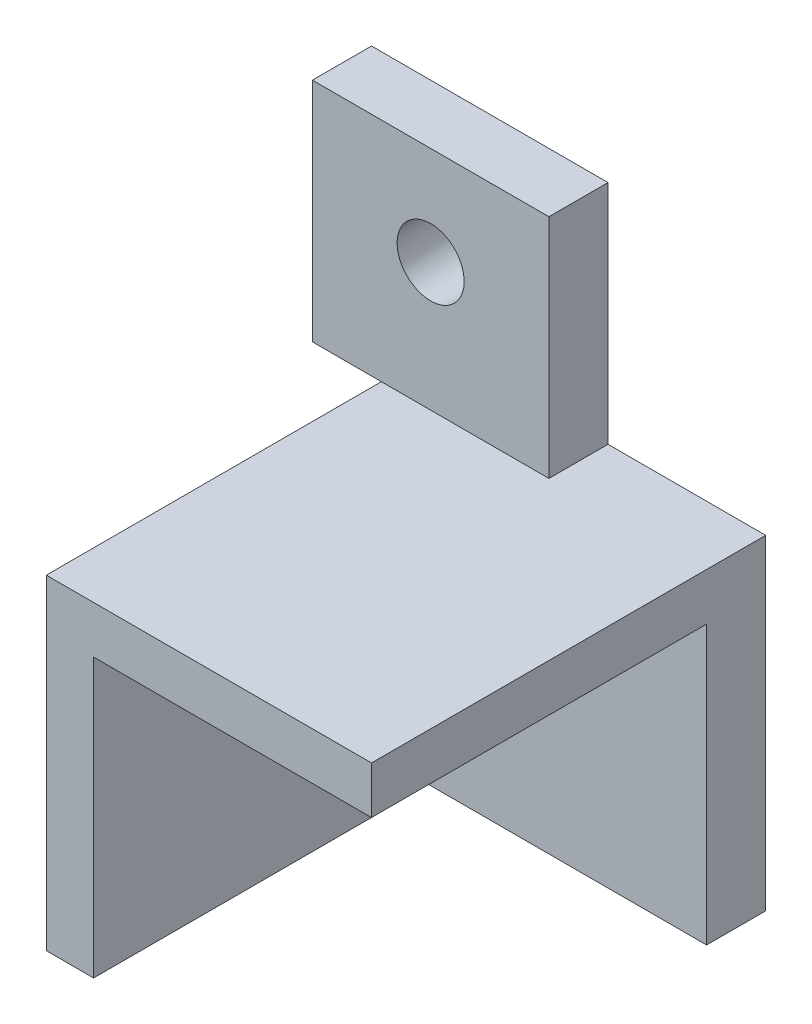
ISO-10303-21;
HEADER;
FILE_DESCRIPTION(('STEP AP214'),'2;1');
FILE_NAME('part.step','',(''),(''),'','','');
FILE_SCHEMA(('AUTOMOTIVE_DESIGN { 1 0 10303 214 1 1 1 1 }'));
ENDSEC;
DATA;
#1=APPLICATION_CONTEXT('core data for automotive mechanical design processes');
#2=APPLICATION_PROTOCOL_DEFINITION('international standard','automotive_design',2000,#1);
#3=PRODUCT_CONTEXT('',#1,'mechanical');
#4=PRODUCT('Part','Part','',(#3));
#5=PRODUCT_RELATED_PRODUCT_CATEGORY('part','',(#4));
#6=PRODUCT_DEFINITION_FORMATION('','',#4);
#7=PRODUCT_DEFINITION_CONTEXT('part definition',#1,'design');
#8=PRODUCT_DEFINITION('design','',#6,#7);
#9=PRODUCT_DEFINITION_SHAPE('','',#8);
#10=(LENGTH_UNIT() NAMED_UNIT(*) SI_UNIT(.MILLI.,.METRE.));
#11=(NAMED_UNIT(*) PLANE_ANGLE_UNIT() SI_UNIT($,.RADIAN.));
#12=(NAMED_UNIT(*) SI_UNIT($,.STERADIAN.) SOLID_ANGLE_UNIT());
#13=UNCERTAINTY_MEASURE_WITH_UNIT(LENGTH_MEASURE(1.E-05),#10,'distance_accuracy_value','');
#14=(GEOMETRIC_REPRESENTATION_CONTEXT(3) GLOBAL_UNCERTAINTY_ASSIGNED_CONTEXT((#13)) GLOBAL_UNIT_ASSIGNED_CONTEXT((#10,
#11,#12)) REPRESENTATION_CONTEXT('',''));
#15=CARTESIAN_POINT('',(0.,0.,0.));
#16=DIRECTION('',(0.,0.,1.));
#17=DIRECTION('',(1.,0.,0.));
#18=AXIS2_PLACEMENT_3D('',#15,#16,#17);
#19=CARTESIAN_POINT('',(-198.,66.,181.4));
#20=DIRECTION('',(0.,0.,1.));
#21=DIRECTION('',(0.,1.,0.));
#22=AXIS2_PLACEMENT_3D('',#19,#20,#21);
#23=CYLINDRICAL_SURFACE('',#22,1.7);
#24=DIRECTION('',(0.,0.,1.));
#25=VECTOR('',#24,1.);
#26=CARTESIAN_POINT('',(-198.,67.7,181.4));
#27=LINE('',#26,#25);
#28=CARTESIAN_POINT('',(-198.,67.7,181.5));
#29=VERTEX_POINT('',#28);
#30=CARTESIAN_POINT('',(-198.,67.7,184.5));
#31=VERTEX_POINT('',#30);
#32=EDGE_CURVE('E9',#29,#31,#27,.T.);
#33=ORIENTED_EDGE('',*,*,#32,.F.);
#34=CARTESIAN_POINT('',(-198.,66.,181.5));
#35=DIRECTION('',(0.,0.,1.));
#36=DIRECTION('',(0.,1.,0.));
#37=AXIS2_PLACEMENT_3D('',#34,#35,#36);
#38=CIRCLE('',#37,1.7);
#39=EDGE_CURVE('E212',#29,#29,#38,.T.);
#40=ORIENTED_EDGE('',*,*,#39,.F.);
#41=ORIENTED_EDGE('',*,*,#32,.T.);
#42=CARTESIAN_POINT('',(-198.,66.,184.5));
#43=DIRECTION('',(0.,0.,1.));
#44=DIRECTION('',(0.,1.,0.));
#45=AXIS2_PLACEMENT_3D('',#42,#43,#44);
#46=CIRCLE('',#45,1.7);
#47=EDGE_CURVE('E147',#31,#31,#46,.T.);
#48=ORIENTED_EDGE('',*,*,#47,.T.);
#49=EDGE_LOOP('',(#33,#40,#41,#48));
#50=FACE_BOUND('',#49,.T.);
#51=ADVANCED_FACE('F14',(#50),#23,.F.);
#52=CARTESIAN_POINT('',(-192.,71.,181.5));
#53=DIRECTION('',(0.,1.,0.));
#54=DIRECTION('',(1.,0.,0.));
#55=AXIS2_PLACEMENT_3D('',#52,#53,#54);
#56=PLANE('',#55);
#57=DIRECTION('',(0.,0.,1.));
#58=VECTOR('',#57,1.);
#59=CARTESIAN_POINT('',(-192.,71.,181.5));
#60=LINE('',#59,#58);
#61=CARTESIAN_POINT('',(-192.,71.,181.5));
#62=VERTEX_POINT('',#61);
#63=CARTESIAN_POINT('',(-192.,71.,184.5));
#64=VERTEX_POINT('',#63);
#65=EDGE_CURVE('E191',#62,#64,#60,.T.);
#66=ORIENTED_EDGE('',*,*,#65,.F.);
#67=DIRECTION('',(-1.,0.,0.));
#68=VECTOR('',#67,1.);
#69=CARTESIAN_POINT('',(-192.,71.,181.5));
#70=LINE('',#69,#68);
#71=CARTESIAN_POINT('',(-204.,71.,181.5));
#72=VERTEX_POINT('',#71);
#73=EDGE_CURVE('E180',#62,#72,#70,.T.);
#74=ORIENTED_EDGE('',*,*,#73,.T.);
#75=DIRECTION('',(0.,0.,1.));
#76=VECTOR('',#75,1.);
#77=CARTESIAN_POINT('',(-204.,71.,181.5));
#78=LINE('',#77,#76);
#79=CARTESIAN_POINT('',(-204.,71.,184.5));
#80=VERTEX_POINT('',#79);
#81=EDGE_CURVE('E25',#72,#80,#78,.T.);
#82=ORIENTED_EDGE('',*,*,#81,.T.);
#83=DIRECTION('',(-1.,0.,0.));
#84=VECTOR('',#83,1.);
#85=CARTESIAN_POINT('',(-192.,71.,184.5));
#86=LINE('',#85,#84);
#87=EDGE_CURVE('E143',#64,#80,#86,.T.);
#88=ORIENTED_EDGE('',*,*,#87,.F.);
#89=EDGE_LOOP('',(#66,#74,#82,#88));
#90=FACE_BOUND('',#89,.T.);
#91=ADVANCED_FACE('F318',(#90),#56,.T.);
#92=CARTESIAN_POINT('',(-204.,59.5,181.5));
#93=DIRECTION('',(-1.,0.,0.));
#94=DIRECTION('',(0.,0.,1.));
#95=AXIS2_PLACEMENT_3D('',#92,#93,#94);
#96=PLANE('',#95);
#97=DIRECTION('',(0.,1.,0.));
#98=VECTOR('',#97,1.);
#99=CARTESIAN_POINT('',(-204.,59.5,181.5));
#100=LINE('',#99,#98);
#101=CARTESIAN_POINT('',(-204.,59.5,181.5));
#102=VERTEX_POINT('',#101);
#103=EDGE_CURVE('E161',#102,#72,#100,.T.);
#104=ORIENTED_EDGE('',*,*,#103,.F.);
#105=DIRECTION('',(0.,0.,1.));
#106=VECTOR('',#105,1.);
#107=CARTESIAN_POINT('',(-204.,59.5,181.5));
#108=LINE('',#107,#106);
#109=CARTESIAN_POINT('',(-204.,59.5,184.5));
#110=VERTEX_POINT('',#109);
#111=EDGE_CURVE('E152',#102,#110,#108,.T.);
#112=ORIENTED_EDGE('',*,*,#111,.T.);
#113=DIRECTION('',(0.,1.,0.));
#114=VECTOR('',#113,1.);
#115=CARTESIAN_POINT('',(-204.,59.5,184.5));
#116=LINE('',#115,#114);
#117=EDGE_CURVE('E136',#110,#80,#116,.T.);
#118=ORIENTED_EDGE('',*,*,#117,.T.);
#119=ORIENTED_EDGE('',*,*,#81,.F.);
#120=EDGE_LOOP('',(#104,#112,#118,#119));
#121=FACE_BOUND('',#120,.T.);
#122=ADVANCED_FACE('F159',(#121),#96,.T.);
#123=CARTESIAN_POINT('',(-192.,59.5,181.5));
#124=DIRECTION('',(-1.,0.,0.));
#125=DIRECTION('',(0.,0.,1.));
#126=AXIS2_PLACEMENT_3D('',#123,#124,#125);
#127=PLANE('',#126);
#128=ORIENTED_EDGE('',*,*,#65,.T.);
#129=DIRECTION('',(0.,1.,0.));
#130=VECTOR('',#129,1.);
#131=CARTESIAN_POINT('',(-192.,59.5,184.5));
#132=LINE('',#131,#130);
#133=CARTESIAN_POINT('',(-192.,59.5,184.5));
#134=VERTEX_POINT('',#133);
#135=EDGE_CURVE('E158',#134,#64,#132,.T.);
#136=ORIENTED_EDGE('',*,*,#135,.F.);
#137=DIRECTION('',(0.,0.,1.));
#138=VECTOR('',#137,1.);
#139=CARTESIAN_POINT('',(-192.,59.5,181.5));
#140=LINE('',#139,#138);
#141=CARTESIAN_POINT('',(-192.,59.5,181.5));
#142=VERTEX_POINT('',#141);
#143=EDGE_CURVE('E170',#142,#134,#140,.T.);
#144=ORIENTED_EDGE('',*,*,#143,.F.);
#145=DIRECTION('',(0.,1.,0.));
#146=VECTOR('',#145,1.);
#147=CARTESIAN_POINT('',(-192.,59.5,181.5));
#148=LINE('',#147,#146);
#149=EDGE_CURVE('E176',#142,#62,#148,.T.);
#150=ORIENTED_EDGE('',*,*,#149,.T.);
#151=EDGE_LOOP('',(#128,#136,#144,#150));
#152=FACE_BOUND('',#151,.T.);
#153=ADVANCED_FACE('F326',(#152),#127,.F.);
#154=CARTESIAN_POINT('',(-192.,59.5,184.5));
#155=DIRECTION('',(0.,0.,1.));
#156=DIRECTION('',(1.,0.,0.));
#157=AXIS2_PLACEMENT_3D('',#154,#155,#156);
#158=PLANE('',#157);
#159=ORIENTED_EDGE('',*,*,#47,.F.);
#160=EDGE_LOOP('',(#159));
#161=FACE_BOUND('',#160,.T.);
#162=DIRECTION('',(-1.,0.,0.));
#163=VECTOR('',#162,1.);
#164=CARTESIAN_POINT('',(-192.,59.5,184.5));
#165=LINE('',#164,#163);
#166=CARTESIAN_POINT('',(-200.5,59.5,184.5));
#167=VERTEX_POINT('',#166);
#168=EDGE_CURVE('E164',#134,#167,#165,.T.);
#169=ORIENTED_EDGE('',*,*,#168,.F.);
#170=ORIENTED_EDGE('',*,*,#135,.T.);
#171=ORIENTED_EDGE('',*,*,#87,.T.);
#172=ORIENTED_EDGE('',*,*,#117,.F.);
#173=DIRECTION('',(-1.,0.,0.));
#174=VECTOR('',#173,1.);
#175=CARTESIAN_POINT('',(-192.,59.5,184.5));
#176=LINE('',#175,#174);
#177=EDGE_CURVE('E18',#167,#110,#176,.T.);
#178=ORIENTED_EDGE('',*,*,#177,.F.);
#179=EDGE_LOOP('',(#169,#170,#171,#172,#178));
#180=FACE_BOUND('',#179,.T.);
#181=ADVANCED_FACE('F139',(#161,#180),#158,.T.);
#182=CARTESIAN_POINT('',(-192.,59.5,181.5));
#183=DIRECTION('',(0.,1.,0.));
#184=DIRECTION('',(1.,0.,0.));
#185=AXIS2_PLACEMENT_3D('',#182,#183,#184);
#186=PLANE('',#185);
#187=ORIENTED_EDGE('',*,*,#111,.F.);
#188=DIRECTION('',(-1.,0.,0.));
#189=VECTOR('',#188,1.);
#190=CARTESIAN_POINT('',(-192.,59.5,181.5));
#191=LINE('',#190,#189);
#192=CARTESIAN_POINT('',(-200.5,59.5,181.5));
#193=VERTEX_POINT('',#192);
#194=EDGE_CURVE('E181',#193,#102,#191,.T.);
#195=ORIENTED_EDGE('',*,*,#194,.F.);
#196=DIRECTION('',(0.,0.,1.));
#197=VECTOR('',#196,1.);
#198=CARTESIAN_POINT('',(-200.5,59.5,181.5));
#199=LINE('',#198,#197);
#200=EDGE_CURVE('E155',#193,#167,#199,.T.);
#201=ORIENTED_EDGE('',*,*,#200,.T.);
#202=ORIENTED_EDGE('',*,*,#177,.T.);
#203=EDGE_LOOP('',(#187,#195,#201,#202));
#204=FACE_BOUND('',#203,.T.);
#205=ADVANCED_FACE('F151',(#204),#186,.F.);
#206=CARTESIAN_POINT('',(-183.9,57.1,184.5));
#207=DIRECTION('',(0.,1.,0.));
#208=DIRECTION('',(1.,0.,0.));
#209=AXIS2_PLACEMENT_3D('',#206,#207,#208);
#210=PLANE('',#209);
#211=DIRECTION('',(-1.,0.,0.));
#212=VECTOR('',#211,1.);
#213=CARTESIAN_POINT('',(-183.95,57.1,201.5));
#214=LINE('',#213,#212);
#215=CARTESIAN_POINT('',(-184.,57.1,201.5));
#216=VERTEX_POINT('',#215);
#217=CARTESIAN_POINT('',(-198.1,57.1,201.5));
#218=VERTEX_POINT('',#217);
#219=EDGE_CURVE('E224',#216,#218,#214,.T.);
#220=ORIENTED_EDGE('',*,*,#219,.T.);
#221=DIRECTION('',(0.,0.,1.));
#222=VECTOR('',#221,1.);
#223=CARTESIAN_POINT('',(-198.1,57.1,184.5));
#224=LINE('',#223,#222);
#225=CARTESIAN_POINT('',(-198.1,57.1,184.5));
#226=VERTEX_POINT('',#225);
#227=EDGE_CURVE('E231',#226,#218,#224,.T.);
#228=ORIENTED_EDGE('',*,*,#227,.F.);
#229=DIRECTION('',(-1.,0.,0.));
#230=VECTOR('',#229,1.);
#231=CARTESIAN_POINT('',(-183.9,57.1,184.5));
#232=LINE('',#231,#230);
#233=CARTESIAN_POINT('',(-184.,57.1,184.5));
#234=VERTEX_POINT('',#233);
#235=EDGE_CURVE('E233',#234,#226,#232,.T.);
#236=ORIENTED_EDGE('',*,*,#235,.F.);
#237=DIRECTION('',(0.,0.,-1.));
#238=VECTOR('',#237,1.);
#239=CARTESIAN_POINT('',(-184.,57.1,183.));
#240=LINE('',#239,#238);
#241=EDGE_CURVE('E208',#216,#234,#240,.T.);
#242=ORIENTED_EDGE('',*,*,#241,.F.);
#243=EDGE_LOOP('',(#220,#228,#236,#242));
#244=FACE_BOUND('',#243,.T.);
#245=ADVANCED_FACE('F338',(#244),#210,.F.);
#246=CARTESIAN_POINT('',(-184.,59.5,181.5));
#247=DIRECTION('',(0.,1.,0.));
#248=DIRECTION('',(1.,0.,0.));
#249=AXIS2_PLACEMENT_3D('',#246,#247,#248);
#250=PLANE('',#249);
#251=DIRECTION('',(-1.,0.,0.));
#252=VECTOR('',#251,1.);
#253=CARTESIAN_POINT('',(-184.,59.5,201.5));
#254=LINE('',#253,#252);
#255=CARTESIAN_POINT('',(-184.,59.5,201.5));
#256=VERTEX_POINT('',#255);
#257=CARTESIAN_POINT('',(-200.5,59.5,201.5));
#258=VERTEX_POINT('',#257);
#259=EDGE_CURVE('E221',#256,#258,#254,.T.);
#260=ORIENTED_EDGE('',*,*,#259,.F.);
#261=DIRECTION('',(0.,0.,1.));
#262=VECTOR('',#261,1.);
#263=CARTESIAN_POINT('',(-184.,59.5,181.5));
#264=LINE('',#263,#262);
#265=CARTESIAN_POINT('',(-184.,59.5,181.5));
#266=VERTEX_POINT('',#265);
#267=EDGE_CURVE('E174',#266,#256,#264,.T.);
#268=ORIENTED_EDGE('',*,*,#267,.F.);
#269=DIRECTION('',(-1.,0.,0.));
#270=VECTOR('',#269,1.);
#271=CARTESIAN_POINT('',(-184.,59.5,181.5));
#272=LINE('',#271,#270);
#273=EDGE_CURVE('E179',#266,#142,#272,.T.);
#274=ORIENTED_EDGE('',*,*,#273,.T.);
#275=ORIENTED_EDGE('',*,*,#143,.T.);
#276=ORIENTED_EDGE('',*,*,#168,.T.);
#277=DIRECTION('',(0.,0.,1.));
#278=VECTOR('',#277,1.);
#279=CARTESIAN_POINT('',(-200.5,59.5,181.5));
#280=LINE('',#279,#278);
#281=EDGE_CURVE('E225',#167,#258,#280,.T.);
#282=ORIENTED_EDGE('',*,*,#281,.T.);
#283=EDGE_LOOP('',(#260,#268,#274,#275,#276,#282));
#284=FACE_BOUND('',#283,.T.);
#285=ADVANCED_FACE('F299',(#284),#250,.T.);
#286=CARTESIAN_POINT('',(-184.,43.,181.5));
#287=DIRECTION('',(0.,0.,1.));
#288=DIRECTION('',(1.,0.,0.));
#289=AXIS2_PLACEMENT_3D('',#286,#287,#288);
#290=PLANE('',#289);
#291=ORIENTED_EDGE('',*,*,#39,.T.);
#292=EDGE_LOOP('',(#291));
#293=FACE_BOUND('',#292,.T.);
#294=DIRECTION('',(0.,1.,0.));
#295=VECTOR('',#294,1.);
#296=CARTESIAN_POINT('',(-200.5,43.,181.5));
#297=LINE('',#296,#295);
#298=CARTESIAN_POINT('',(-200.5,43.,181.5));
#299=VERTEX_POINT('',#298);
#300=EDGE_CURVE('E229',#299,#193,#297,.T.);
#301=ORIENTED_EDGE('',*,*,#300,.T.);
#302=ORIENTED_EDGE('',*,*,#194,.T.);
#303=ORIENTED_EDGE('',*,*,#103,.T.);
#304=ORIENTED_EDGE('',*,*,#73,.F.);
#305=ORIENTED_EDGE('',*,*,#149,.F.);
#306=ORIENTED_EDGE('',*,*,#273,.F.);
#307=DIRECTION('',(0.,1.,0.));
#308=VECTOR('',#307,1.);
#309=CARTESIAN_POINT('',(-184.,43.,181.5));
#310=LINE('',#309,#308);
#311=CARTESIAN_POINT('',(-184.,43.,181.5));
#312=VERTEX_POINT('',#311);
#313=EDGE_CURVE('E184',#312,#266,#310,.T.);
#314=ORIENTED_EDGE('',*,*,#313,.F.);
#315=DIRECTION('',(-1.,0.,0.));
#316=VECTOR('',#315,1.);
#317=CARTESIAN_POINT('',(-184.,43.,181.5));
#318=LINE('',#317,#316);
#319=EDGE_CURVE('E192',#312,#299,#318,.T.);
#320=ORIENTED_EDGE('',*,*,#319,.T.);
#321=EDGE_LOOP('',(#301,#302,#303,#304,#305,#306,#314,#320));
#322=FACE_BOUND('',#321,.T.);
#323=ADVANCED_FACE('F16',(#293,#322),#290,.F.);
#324=CARTESIAN_POINT('',(-200.5,43.,181.5));
#325=DIRECTION('',(-1.,0.,0.));
#326=DIRECTION('',(0.,0.,1.));
#327=AXIS2_PLACEMENT_3D('',#324,#325,#326);
#328=PLANE('',#327);
#329=ORIENTED_EDGE('',*,*,#300,.F.);
#330=DIRECTION('',(0.,0.,1.));
#331=VECTOR('',#330,1.);
#332=CARTESIAN_POINT('',(-200.5,43.,181.5));
#333=LINE('',#332,#331);
#334=CARTESIAN_POINT('',(-200.5,43.,201.5));
#335=VERTEX_POINT('',#334);
#336=EDGE_CURVE('E197',#299,#335,#333,.T.);
#337=ORIENTED_EDGE('',*,*,#336,.T.);
#338=DIRECTION('',(0.,1.,0.));
#339=VECTOR('',#338,1.);
#340=CARTESIAN_POINT('',(-200.5,43.,201.5));
#341=LINE('',#340,#339);
#342=EDGE_CURVE('E116',#335,#258,#341,.T.);
#343=ORIENTED_EDGE('',*,*,#342,.T.);
#344=ORIENTED_EDGE('',*,*,#281,.F.);
#345=ORIENTED_EDGE('',*,*,#200,.F.);
#346=EDGE_LOOP('',(#329,#337,#343,#344,#345));
#347=FACE_BOUND('',#346,.T.);
#348=ADVANCED_FACE('F303',(#347),#328,.T.);
#349=CARTESIAN_POINT('',(-184.,43.,201.5));
#350=DIRECTION('',(0.,0.,1.));
#351=DIRECTION('',(1.,0.,0.));
#352=AXIS2_PLACEMENT_3D('',#349,#350,#351);
#353=PLANE('',#352);
#354=DIRECTION('',(-1.,0.,0.));
#355=VECTOR('',#354,1.);
#356=CARTESIAN_POINT('',(-184.,43.,201.5));
#357=LINE('',#356,#355);
#358=CARTESIAN_POINT('',(-198.1,43.,201.5));
#359=VERTEX_POINT('',#358);
#360=EDGE_CURVE('E202',#359,#335,#357,.T.);
#361=ORIENTED_EDGE('',*,*,#360,.F.);
#362=DIRECTION('',(0.,-1.,0.));
#363=VECTOR('',#362,1.);
#364=CARTESIAN_POINT('',(-198.1,42.95,201.5));
#365=LINE('',#364,#363);
#366=EDGE_CURVE('E127',#218,#359,#365,.T.);
#367=ORIENTED_EDGE('',*,*,#366,.F.);
#368=ORIENTED_EDGE('',*,*,#219,.F.);
#369=DIRECTION('',(0.,1.,0.));
#370=VECTOR('',#369,1.);
#371=CARTESIAN_POINT('',(-184.,43.,201.5));
#372=LINE('',#371,#370);
#373=EDGE_CURVE('E265',#216,#256,#372,.T.);
#374=ORIENTED_EDGE('',*,*,#373,.T.);
#375=ORIENTED_EDGE('',*,*,#259,.T.);
#376=ORIENTED_EDGE('',*,*,#342,.F.);
#377=EDGE_LOOP('',(#361,#367,#368,#374,#375,#376));
#378=FACE_BOUND('',#377,.T.);
#379=ADVANCED_FACE('F304',(#378),#353,.T.);
#380=CARTESIAN_POINT('',(-198.1,42.9,184.5));
#381=DIRECTION('',(-1.,0.,0.));
#382=DIRECTION('',(0.,0.,1.));
#383=AXIS2_PLACEMENT_3D('',#380,#381,#382);
#384=PLANE('',#383);
#385=ORIENTED_EDGE('',*,*,#227,.T.);
#386=ORIENTED_EDGE('',*,*,#366,.T.);
#387=DIRECTION('',(0.,0.,1.));
#388=VECTOR('',#387,1.);
#389=CARTESIAN_POINT('',(-198.1,43.,183.));
#390=LINE('',#389,#388);
#391=CARTESIAN_POINT('',(-198.1,43.,184.5));
#392=VERTEX_POINT('',#391);
#393=EDGE_CURVE('E217',#392,#359,#390,.T.);
#394=ORIENTED_EDGE('',*,*,#393,.F.);
#395=DIRECTION('',(0.,1.,0.));
#396=VECTOR('',#395,1.);
#397=CARTESIAN_POINT('',(-198.1,42.9,184.5));
#398=LINE('',#397,#396);
#399=EDGE_CURVE('E241',#392,#226,#398,.T.);
#400=ORIENTED_EDGE('',*,*,#399,.T.);
#401=EDGE_LOOP('',(#385,#386,#394,#400));
#402=FACE_BOUND('',#401,.T.);
#403=ADVANCED_FACE('F291',(#402),#384,.F.);
#404=CARTESIAN_POINT('',(-183.9,42.9,184.5));
#405=DIRECTION('',(0.,0.,1.));
#406=DIRECTION('',(1.,0.,0.));
#407=AXIS2_PLACEMENT_3D('',#404,#405,#406);
#408=PLANE('',#407);
#409=ORIENTED_EDGE('',*,*,#399,.F.);
#410=DIRECTION('',(1.,0.,0.));
#411=VECTOR('',#410,1.);
#412=CARTESIAN_POINT('',(-183.95,43.,184.5));
#413=LINE('',#412,#411);
#414=CARTESIAN_POINT('',(-184.,43.,184.5));
#415=VERTEX_POINT('',#414);
#416=EDGE_CURVE('E213',#392,#415,#413,.T.);
#417=ORIENTED_EDGE('',*,*,#416,.T.);
#418=DIRECTION('',(0.,1.,0.));
#419=VECTOR('',#418,1.);
#420=CARTESIAN_POINT('',(-184.,42.95,184.5));
#421=LINE('',#420,#419);
#422=EDGE_CURVE('E188',#415,#234,#421,.T.);
#423=ORIENTED_EDGE('',*,*,#422,.T.);
#424=ORIENTED_EDGE('',*,*,#235,.T.);
#425=EDGE_LOOP('',(#409,#417,#423,#424));
#426=FACE_BOUND('',#425,.T.);
#427=ADVANCED_FACE('F312',(#426),#408,.T.);
#428=CARTESIAN_POINT('',(-184.,43.,181.5));
#429=DIRECTION('',(-1.,0.,0.));
#430=DIRECTION('',(0.,0.,1.));
#431=AXIS2_PLACEMENT_3D('',#428,#429,#430);
#432=PLANE('',#431);
#433=ORIENTED_EDGE('',*,*,#373,.F.);
#434=ORIENTED_EDGE('',*,*,#241,.T.);
#435=ORIENTED_EDGE('',*,*,#422,.F.);
#436=DIRECTION('',(0.,0.,1.));
#437=VECTOR('',#436,1.);
#438=CARTESIAN_POINT('',(-184.,43.,181.5));
#439=LINE('',#438,#437);
#440=EDGE_CURVE('E196',#312,#415,#439,.T.);
#441=ORIENTED_EDGE('',*,*,#440,.F.);
#442=ORIENTED_EDGE('',*,*,#313,.T.);
#443=ORIENTED_EDGE('',*,*,#267,.T.);
#444=EDGE_LOOP('',(#433,#434,#435,#441,#442,#443));
#445=FACE_BOUND('',#444,.T.);
#446=ADVANCED_FACE('F329',(#445),#432,.F.);
#447=CARTESIAN_POINT('',(-184.,43.,181.5));
#448=DIRECTION('',(0.,1.,0.));
#449=DIRECTION('',(1.,0.,0.));
#450=AXIS2_PLACEMENT_3D('',#447,#448,#449);
#451=PLANE('',#450);
#452=ORIENTED_EDGE('',*,*,#416,.F.);
#453=ORIENTED_EDGE('',*,*,#393,.T.);
#454=ORIENTED_EDGE('',*,*,#360,.T.);
#455=ORIENTED_EDGE('',*,*,#336,.F.);
#456=ORIENTED_EDGE('',*,*,#319,.F.);
#457=ORIENTED_EDGE('',*,*,#440,.T.);
#458=EDGE_LOOP('',(#452,#453,#454,#455,#456,#457));
#459=FACE_BOUND('',#458,.T.);
#460=ADVANCED_FACE('F289',(#459),#451,.F.);
#461=CLOSED_SHELL('',(#51,#91,#122,#153,#181,#205,#245,#285,#323,#348,#379,#403,#427,#446,#460));
#462=MANIFOLD_SOLID_BREP('B1',#461);
#463=ADVANCED_BREP_SHAPE_REPRESENTATION('',(#18,#462),#14);
#464=SHAPE_DEFINITION_REPRESENTATION(#9,#463);
ENDSEC;
END-ISO-10303-21;
